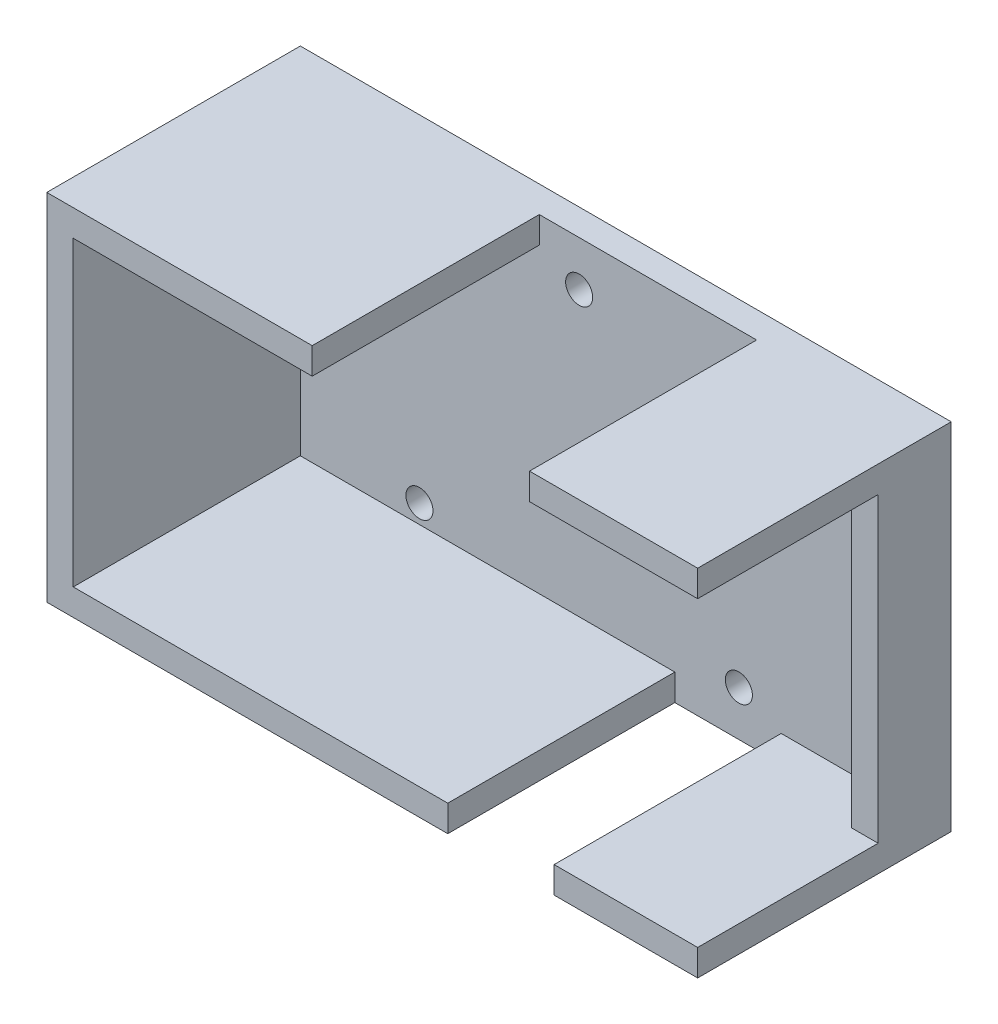
ISO-10303-21;
HEADER;
FILE_DESCRIPTION(('STEP AP214'),'2;1');
FILE_NAME('part.step','',(''),(''),'','','');
FILE_SCHEMA(('AUTOMOTIVE_DESIGN { 1 0 10303 214 1 1 1 1 }'));
ENDSEC;
DATA;
#1=APPLICATION_CONTEXT('core data for automotive mechanical design processes');
#2=APPLICATION_PROTOCOL_DEFINITION('international standard','automotive_design',2000,#1);
#3=PRODUCT_CONTEXT('',#1,'mechanical');
#4=PRODUCT('Part','Part','',(#3));
#5=PRODUCT_RELATED_PRODUCT_CATEGORY('part','',(#4));
#6=PRODUCT_DEFINITION_FORMATION('','',#4);
#7=PRODUCT_DEFINITION_CONTEXT('part definition',#1,'design');
#8=PRODUCT_DEFINITION('design','',#6,#7);
#9=PRODUCT_DEFINITION_SHAPE('','',#8);
#10=(LENGTH_UNIT() NAMED_UNIT(*) SI_UNIT(.MILLI.,.METRE.));
#11=(NAMED_UNIT(*) PLANE_ANGLE_UNIT() SI_UNIT($,.RADIAN.));
#12=(NAMED_UNIT(*) SI_UNIT($,.STERADIAN.) SOLID_ANGLE_UNIT());
#13=UNCERTAINTY_MEASURE_WITH_UNIT(LENGTH_MEASURE(1.E-05),#10,'distance_accuracy_value','');
#14=(GEOMETRIC_REPRESENTATION_CONTEXT(3) GLOBAL_UNCERTAINTY_ASSIGNED_CONTEXT((#13)) GLOBAL_UNIT_ASSIGNED_CONTEXT((#10,
#11,#12)) REPRESENTATION_CONTEXT('',''));
#15=CARTESIAN_POINT('',(0.,0.,0.));
#16=DIRECTION('',(0.,0.,1.));
#17=DIRECTION('',(1.,0.,0.));
#18=AXIS2_PLACEMENT_3D('',#15,#16,#17);
#19=CARTESIAN_POINT('',(-27.4828,-14.986,21.4122));
#20=DIRECTION('',(1.,0.,0.));
#21=DIRECTION('',(0.,0.,-1.));
#22=AXIS2_PLACEMENT_3D('',#19,#20,#21);
#23=PLANE('',#22);
#24=DIRECTION('',(0.,0.,1.));
#25=VECTOR('',#24,1.);
#26=CARTESIAN_POINT('',(-27.4828,-7.2136,0.));
#27=LINE('',#26,#25);
#28=CARTESIAN_POINT('',(-27.4828,-7.2136,0.));
#29=VERTEX_POINT('',#28);
#30=CARTESIAN_POINT('',(-27.4828,-7.2136,0.634999999999999));
#31=VERTEX_POINT('',#30);
#32=EDGE_CURVE('E584',#29,#31,#27,.T.);
#33=ORIENTED_EDGE('',*,*,#32,.F.);
#34=DIRECTION('',(0.,-1.,0.));
#35=VECTOR('',#34,1.);
#36=CARTESIAN_POINT('',(-27.4828,-14.986,0.));
#37=LINE('',#36,#35);
#38=CARTESIAN_POINT('',(-27.4828,-14.986,0.));
#39=VERTEX_POINT('',#38);
#40=EDGE_CURVE('E48',#29,#39,#37,.T.);
#41=ORIENTED_EDGE('',*,*,#40,.T.);
#42=DIRECTION('',(0.,0.,-1.));
#43=VECTOR('',#42,1.);
#44=CARTESIAN_POINT('',(-27.4828,-14.986,21.4122));
#45=LINE('',#44,#43);
#46=CARTESIAN_POINT('',(-27.4828,-14.986,21.4122));
#47=VERTEX_POINT('',#46);
#48=EDGE_CURVE('E556',#47,#39,#45,.T.);
#49=ORIENTED_EDGE('',*,*,#48,.F.);
#50=DIRECTION('',(0.,-1.,0.));
#51=VECTOR('',#50,1.);
#52=CARTESIAN_POINT('',(-27.4828,-14.986,21.4122));
#53=LINE('',#52,#51);
#54=CARTESIAN_POINT('',(-27.4828,14.986,21.4122));
#55=VERTEX_POINT('',#54);
#56=EDGE_CURVE('E518',#55,#47,#53,.T.);
#57=ORIENTED_EDGE('',*,*,#56,.F.);
#58=DIRECTION('',(0.,0.,-1.));
#59=VECTOR('',#58,1.);
#60=CARTESIAN_POINT('',(-27.4828,14.986,21.4122));
#61=LINE('',#60,#59);
#62=CARTESIAN_POINT('',(-27.4828,14.986,0.));
#63=VERTEX_POINT('',#62);
#64=EDGE_CURVE('E55',#55,#63,#61,.T.);
#65=ORIENTED_EDGE('',*,*,#64,.T.);
#66=CARTESIAN_POINT('',(-27.4828,7.366,0.));
#67=VERTEX_POINT('',#66);
#68=EDGE_CURVE('E541',#63,#67,#37,.T.);
#69=ORIENTED_EDGE('',*,*,#68,.T.);
#70=DIRECTION('',(0.,0.,-1.));
#71=VECTOR('',#70,1.);
#72=CARTESIAN_POINT('',(-27.4828,7.366,0.));
#73=LINE('',#72,#71);
#74=CARTESIAN_POINT('',(-27.4828,7.366,0.634999999999998));
#75=VERTEX_POINT('',#74);
#76=EDGE_CURVE('E315',#75,#67,#73,.T.);
#77=ORIENTED_EDGE('',*,*,#76,.F.);
#78=DIRECTION('',(0.,1.,0.));
#79=VECTOR('',#78,1.);
#80=CARTESIAN_POINT('',(-27.4828,7.366,0.634999999999998));
#81=LINE('',#80,#79);
#82=CARTESIAN_POINT('',(-27.4828,5.5372,0.634999999999999));
#83=VERTEX_POINT('',#82);
#84=EDGE_CURVE('E303',#83,#75,#81,.T.);
#85=ORIENTED_EDGE('',*,*,#84,.F.);
#86=DIRECTION('',(0.,0.,1.));
#87=VECTOR('',#86,1.);
#88=CARTESIAN_POINT('',(-27.4828,5.5372,0.));
#89=LINE('',#88,#87);
#90=CARTESIAN_POINT('',(-27.4828,5.5372,0.));
#91=VERTEX_POINT('',#90);
#92=EDGE_CURVE('E298',#91,#83,#89,.T.);
#93=ORIENTED_EDGE('',*,*,#92,.F.);
#94=CARTESIAN_POINT('',(-27.4828,-5.3848,0.));
#95=VERTEX_POINT('',#94);
#96=EDGE_CURVE('E539',#91,#95,#37,.T.);
#97=ORIENTED_EDGE('',*,*,#96,.T.);
#98=DIRECTION('',(0.,0.,-1.));
#99=VECTOR('',#98,1.);
#100=CARTESIAN_POINT('',(-27.4828,-5.3848,0.));
#101=LINE('',#100,#99);
#102=CARTESIAN_POINT('',(-27.4828,-5.3848,0.635));
#103=VERTEX_POINT('',#102);
#104=EDGE_CURVE('E73',#103,#95,#101,.T.);
#105=ORIENTED_EDGE('',*,*,#104,.F.);
#106=DIRECTION('',(0.,1.,0.));
#107=VECTOR('',#106,1.);
#108=CARTESIAN_POINT('',(-27.4828,-5.3848,0.635));
#109=LINE('',#108,#107);
#110=EDGE_CURVE('E66',#31,#103,#109,.T.);
#111=ORIENTED_EDGE('',*,*,#110,.F.);
#112=EDGE_LOOP('',(#33,#41,#49,#57,#65,#69,#77,#85,#93,#97,#105,#111));
#113=FACE_BOUND('',#112,.T.);
#114=ADVANCED_FACE('F44',(#113),#23,.F.);
#115=CARTESIAN_POINT('',(0.,0.,21.4122));
#116=DIRECTION('',(0.,0.,-1.));
#117=DIRECTION('',(-1.,0.,0.));
#118=AXIS2_PLACEMENT_3D('',#115,#116,#117);
#119=PLANE('',#118);
#120=DIRECTION('',(-1.,0.,0.));
#121=VECTOR('',#120,1.);
#122=CARTESIAN_POINT('',(-27.4828,14.986,21.4122));
#123=LINE('',#122,#121);
#124=CARTESIAN_POINT('',(27.4828,14.986,21.4122));
#125=VERTEX_POINT('',#124);
#126=CARTESIAN_POINT('',(13.2840158304135,14.986,21.4122));
#127=VERTEX_POINT('',#126);
#128=EDGE_CURVE('E514',#125,#127,#123,.T.);
#129=ORIENTED_EDGE('',*,*,#128,.T.);
#130=DIRECTION('',(0.,1.,0.));
#131=VECTOR('',#130,1.);
#132=CARTESIAN_POINT('',(13.2840158304135,14.986,21.4122));
#133=LINE('',#132,#131);
#134=CARTESIAN_POINT('',(13.2840158304135,12.7508,21.4122));
#135=VERTEX_POINT('',#134);
#136=EDGE_CURVE('E362',#135,#127,#133,.T.);
#137=ORIENTED_EDGE('',*,*,#136,.F.);
#138=DIRECTION('',(-1.,0.,0.));
#139=VECTOR('',#138,1.);
#140=CARTESIAN_POINT('',(0.,12.7508,21.4122));
#141=LINE('',#140,#139);
#142=CARTESIAN_POINT('',(27.4828,12.7508,21.4122));
#143=VERTEX_POINT('',#142);
#144=EDGE_CURVE('E496',#143,#135,#141,.T.);
#145=ORIENTED_EDGE('',*,*,#144,.F.);
#146=DIRECTION('',(0.,1.,0.));
#147=VECTOR('',#146,1.);
#148=CARTESIAN_POINT('',(27.4828,-14.986,21.4122));
#149=LINE('',#148,#147);
#150=EDGE_CURVE('E513',#143,#125,#149,.T.);
#151=ORIENTED_EDGE('',*,*,#150,.T.);
#152=EDGE_LOOP('',(#129,#137,#145,#151));
#153=FACE_BOUND('',#152,.T.);
#154=ADVANCED_FACE('F616',(#153),#119,.F.);
#155=CARTESIAN_POINT('',(-27.4828,12.7508,21.4122));
#156=DIRECTION('',(0.,-1.,0.));
#157=DIRECTION('',(0.,0.,-1.));
#158=AXIS2_PLACEMENT_3D('',#155,#156,#157);
#159=PLANE('',#158);
#160=DIRECTION('',(0.,0.,1.));
#161=VECTOR('',#160,1.);
#162=CARTESIAN_POINT('',(13.2840158304135,12.7508,-16.2527545378796));
#163=LINE('',#162,#161);
#164=CARTESIAN_POINT('',(13.2840158304135,12.7508,2.2352));
#165=VERTEX_POINT('',#164);
#166=EDGE_CURVE('E365',#165,#135,#163,.T.);
#167=ORIENTED_EDGE('',*,*,#166,.F.);
#168=DIRECTION('',(-1.,0.,0.));
#169=VECTOR('',#168,1.);
#170=CARTESIAN_POINT('',(0.,12.7508,2.2352));
#171=LINE('',#170,#169);
#172=CARTESIAN_POINT('',(25.2476,12.7508,2.2352));
#173=VERTEX_POINT('',#172);
#174=EDGE_CURVE('E477',#173,#165,#171,.T.);
#175=ORIENTED_EDGE('',*,*,#174,.F.);
#176=DIRECTION('',(0.,0.,-1.));
#177=VECTOR('',#176,1.);
#178=CARTESIAN_POINT('',(25.2476,12.7508,21.4122));
#179=LINE('',#178,#177);
#180=CARTESIAN_POINT('',(25.2476,12.7508,6.1722));
#181=VERTEX_POINT('',#180);
#182=EDGE_CURVE('E466',#181,#173,#179,.T.);
#183=ORIENTED_EDGE('',*,*,#182,.F.);
#184=DIRECTION('',(-1.,0.,0.));
#185=VECTOR('',#184,1.);
#186=CARTESIAN_POINT('',(25.2476,12.7508,6.1722));
#187=LINE('',#186,#185);
#188=CARTESIAN_POINT('',(27.4828,12.7508,6.1722));
#189=VERTEX_POINT('',#188);
#190=EDGE_CURVE('E435',#189,#181,#187,.T.);
#191=ORIENTED_EDGE('',*,*,#190,.F.);
#192=DIRECTION('',(0.,0.,1.));
#193=VECTOR('',#192,1.);
#194=CARTESIAN_POINT('',(27.4828,12.7508,6.1722));
#195=LINE('',#194,#193);
#196=EDGE_CURVE('E439',#189,#143,#195,.T.);
#197=ORIENTED_EDGE('',*,*,#196,.T.);
#198=ORIENTED_EDGE('',*,*,#144,.T.);
#199=EDGE_LOOP('',(#167,#175,#183,#191,#197,#198));
#200=FACE_BOUND('',#199,.T.);
#201=ADVANCED_FACE('F621',(#200),#159,.T.);
#202=CARTESIAN_POINT('',(-5.06832309286009,12.7508,21.4122));
#203=VERTEX_POINT('',#202);
#204=CARTESIAN_POINT('',(-25.2476,12.7508,21.4122));
#205=VERTEX_POINT('',#204);
#206=EDGE_CURVE('E495',#203,#205,#141,.T.);
#207=ORIENTED_EDGE('',*,*,#206,.F.);
#208=DIRECTION('',(0.,-1.,0.));
#209=VECTOR('',#208,1.);
#210=CARTESIAN_POINT('',(-5.06832309286009,14.986,21.4122));
#211=LINE('',#210,#209);
#212=CARTESIAN_POINT('',(-5.06832309286009,14.986,21.4122));
#213=VERTEX_POINT('',#212);
#214=EDGE_CURVE('E360',#213,#203,#211,.T.);
#215=ORIENTED_EDGE('',*,*,#214,.F.);
#216=EDGE_CURVE('E512',#213,#55,#123,.T.);
#217=ORIENTED_EDGE('',*,*,#216,.T.);
#218=ORIENTED_EDGE('',*,*,#56,.T.);
#219=DIRECTION('',(1.,0.,0.));
#220=VECTOR('',#219,1.);
#221=CARTESIAN_POINT('',(-27.4828,-14.986,21.4122));
#222=LINE('',#221,#220);
#223=CARTESIAN_POINT('',(6.37948859144543,-14.986,21.4122));
#224=VERTEX_POINT('',#223);
#225=EDGE_CURVE('E522',#47,#224,#222,.T.);
#226=ORIENTED_EDGE('',*,*,#225,.T.);
#227=DIRECTION('',(0.,-1.,0.));
#228=VECTOR('',#227,1.);
#229=CARTESIAN_POINT('',(6.37948859144543,-14.986,21.4122));
#230=LINE('',#229,#228);
#231=CARTESIAN_POINT('',(6.37948859144543,-12.7508,21.4122));
#232=VERTEX_POINT('',#231);
#233=EDGE_CURVE('E394',#232,#224,#230,.T.);
#234=ORIENTED_EDGE('',*,*,#233,.F.);
#235=DIRECTION('',(1.,0.,0.));
#236=VECTOR('',#235,1.);
#237=CARTESIAN_POINT('',(0.,-12.7508,21.4122));
#238=LINE('',#237,#236);
#239=CARTESIAN_POINT('',(-25.2476,-12.7508,21.4122));
#240=VERTEX_POINT('',#239);
#241=EDGE_CURVE('E476',#240,#232,#238,.T.);
#242=ORIENTED_EDGE('',*,*,#241,.F.);
#243=DIRECTION('',(0.,-1.,0.));
#244=VECTOR('',#243,1.);
#245=CARTESIAN_POINT('',(-25.2476,0.,21.4122));
#246=LINE('',#245,#244);
#247=EDGE_CURVE('E500',#205,#240,#246,.T.);
#248=ORIENTED_EDGE('',*,*,#247,.F.);
#249=EDGE_LOOP('',(#207,#215,#217,#218,#226,#234,#242,#248));
#250=FACE_BOUND('',#249,.T.);
#251=ADVANCED_FACE('F623',(#250),#119,.F.);
#252=CARTESIAN_POINT('',(-27.4828,-12.7508,21.4122));
#253=DIRECTION('',(0.,1.,0.));
#254=DIRECTION('',(0.,0.,1.));
#255=AXIS2_PLACEMENT_3D('',#252,#253,#254);
#256=PLANE('',#255);
#257=DIRECTION('',(0.,0.,1.));
#258=VECTOR('',#257,1.);
#259=CARTESIAN_POINT('',(6.37948859144543,-12.7508,-16.2527545378796));
#260=LINE('',#259,#258);
#261=CARTESIAN_POINT('',(6.37948859144543,-12.7508,2.2352));
#262=VERTEX_POINT('',#261);
#263=EDGE_CURVE('E397',#262,#232,#260,.T.);
#264=ORIENTED_EDGE('',*,*,#263,.F.);
#265=DIRECTION('',(1.,0.,0.));
#266=VECTOR('',#265,1.);
#267=CARTESIAN_POINT('',(0.,-12.7508,2.2352));
#268=LINE('',#267,#266);
#269=CARTESIAN_POINT('',(-25.2476,-12.7508,2.2352));
#270=VERTEX_POINT('',#269);
#271=EDGE_CURVE('E491',#270,#262,#268,.T.);
#272=ORIENTED_EDGE('',*,*,#271,.F.);
#273=DIRECTION('',(0.,0.,-1.));
#274=VECTOR('',#273,1.);
#275=CARTESIAN_POINT('',(-25.2476,-12.7508,21.4122));
#276=LINE('',#275,#274);
#277=EDGE_CURVE('E475',#240,#270,#276,.T.);
#278=ORIENTED_EDGE('',*,*,#277,.F.);
#279=ORIENTED_EDGE('',*,*,#241,.T.);
#280=EDGE_LOOP('',(#264,#272,#278,#279));
#281=FACE_BOUND('',#280,.T.);
#282=ADVANCED_FACE('F635',(#281),#256,.T.);
#283=CARTESIAN_POINT('',(15.3610224191685,-12.7508,21.4122));
#284=VERTEX_POINT('',#283);
#285=CARTESIAN_POINT('',(27.4828,-12.7508,21.4122));
#286=VERTEX_POINT('',#285);
#287=EDGE_CURVE('E504',#284,#286,#238,.T.);
#288=ORIENTED_EDGE('',*,*,#287,.F.);
#289=DIRECTION('',(0.,1.,0.));
#290=VECTOR('',#289,1.);
#291=CARTESIAN_POINT('',(15.3610224191685,-14.986,21.4122));
#292=LINE('',#291,#290);
#293=CARTESIAN_POINT('',(15.3610224191685,-14.986,21.4122));
#294=VERTEX_POINT('',#293);
#295=EDGE_CURVE('E393',#294,#284,#292,.T.);
#296=ORIENTED_EDGE('',*,*,#295,.F.);
#297=CARTESIAN_POINT('',(27.4828,-14.986,21.4122));
#298=VERTEX_POINT('',#297);
#299=EDGE_CURVE('E521',#294,#298,#222,.T.);
#300=ORIENTED_EDGE('',*,*,#299,.T.);
#301=EDGE_CURVE('E508',#298,#286,#149,.T.);
#302=ORIENTED_EDGE('',*,*,#301,.T.);
#303=EDGE_LOOP('',(#288,#296,#300,#302));
#304=FACE_BOUND('',#303,.T.);
#305=ADVANCED_FACE('F624',(#304),#119,.F.);
#306=CARTESIAN_POINT('',(27.4828,-14.986,21.4122));
#307=DIRECTION('',(-1.,0.,0.));
#308=DIRECTION('',(0.,0.,1.));
#309=AXIS2_PLACEMENT_3D('',#306,#307,#308);
#310=PLANE('',#309);
#311=ORIENTED_EDGE('',*,*,#150,.F.);
#312=ORIENTED_EDGE('',*,*,#196,.F.);
#313=DIRECTION('',(0.,1.,0.));
#314=VECTOR('',#313,1.);
#315=CARTESIAN_POINT('',(27.4828,-12.7508,6.1722));
#316=LINE('',#315,#314);
#317=CARTESIAN_POINT('',(27.4828,-12.7508,6.1722));
#318=VERTEX_POINT('',#317);
#319=EDGE_CURVE('E432',#318,#189,#316,.T.);
#320=ORIENTED_EDGE('',*,*,#319,.F.);
#321=DIRECTION('',(0.,0.,1.));
#322=VECTOR('',#321,1.);
#323=CARTESIAN_POINT('',(27.4828,-12.7508,6.1722));
#324=LINE('',#323,#322);
#325=EDGE_CURVE('E438',#318,#286,#324,.T.);
#326=ORIENTED_EDGE('',*,*,#325,.T.);
#327=ORIENTED_EDGE('',*,*,#301,.F.);
#328=DIRECTION('',(0.,0.,-1.));
#329=VECTOR('',#328,1.);
#330=CARTESIAN_POINT('',(27.4828,-14.986,21.4122));
#331=LINE('',#330,#329);
#332=CARTESIAN_POINT('',(27.4828,-14.986,0.));
#333=VERTEX_POINT('',#332);
#334=EDGE_CURVE('E526',#298,#333,#331,.T.);
#335=ORIENTED_EDGE('',*,*,#334,.T.);
#336=DIRECTION('',(0.,1.,0.));
#337=VECTOR('',#336,1.);
#338=CARTESIAN_POINT('',(27.4828,-14.986,0.));
#339=LINE('',#338,#337);
#340=CARTESIAN_POINT('',(27.4828,14.986,0.));
#341=VERTEX_POINT('',#340);
#342=EDGE_CURVE('E469',#333,#341,#339,.T.);
#343=ORIENTED_EDGE('',*,*,#342,.T.);
#344=DIRECTION('',(0.,0.,-1.));
#345=VECTOR('',#344,1.);
#346=CARTESIAN_POINT('',(27.4828,14.986,21.4122));
#347=LINE('',#346,#345);
#348=EDGE_CURVE('E11',#125,#341,#347,.T.);
#349=ORIENTED_EDGE('',*,*,#348,.F.);
#350=EDGE_LOOP('',(#311,#312,#320,#326,#327,#335,#343,#349));
#351=FACE_BOUND('',#350,.T.);
#352=ADVANCED_FACE('F46',(#351),#310,.F.);
#353=CARTESIAN_POINT('',(-27.4828,14.986,21.4122));
#354=DIRECTION('',(0.,-1.,0.));
#355=DIRECTION('',(0.,0.,-1.));
#356=AXIS2_PLACEMENT_3D('',#353,#354,#355);
#357=PLANE('',#356);
#358=DIRECTION('',(-1.,0.,0.));
#359=VECTOR('',#358,1.);
#360=CARTESIAN_POINT('',(-5.06832309286009,14.986,2.2352));
#361=LINE('',#360,#359);
#362=CARTESIAN_POINT('',(13.2840158304135,14.986,2.2352));
#363=VERTEX_POINT('',#362);
#364=CARTESIAN_POINT('',(-5.06832309286009,14.986,2.2352));
#365=VERTEX_POINT('',#364);
#366=EDGE_CURVE('E374',#363,#365,#361,.T.);
#367=ORIENTED_EDGE('',*,*,#366,.F.);
#368=DIRECTION('',(0.,0.,1.));
#369=VECTOR('',#368,1.);
#370=CARTESIAN_POINT('',(13.2840158304135,14.986,-16.2527545378796));
#371=LINE('',#370,#369);
#372=EDGE_CURVE('E378',#363,#127,#371,.T.);
#373=ORIENTED_EDGE('',*,*,#372,.T.);
#374=ORIENTED_EDGE('',*,*,#128,.F.);
#375=ORIENTED_EDGE('',*,*,#348,.T.);
#376=DIRECTION('',(-1.,0.,0.));
#377=VECTOR('',#376,1.);
#378=CARTESIAN_POINT('',(-27.4828,14.986,0.));
#379=LINE('',#378,#377);
#380=EDGE_CURVE('E530',#341,#63,#379,.T.);
#381=ORIENTED_EDGE('',*,*,#380,.T.);
#382=ORIENTED_EDGE('',*,*,#64,.F.);
#383=ORIENTED_EDGE('',*,*,#216,.F.);
#384=DIRECTION('',(0.,0.,1.));
#385=VECTOR('',#384,1.);
#386=CARTESIAN_POINT('',(-5.06832309286009,14.986,-16.2527545378796));
#387=LINE('',#386,#385);
#388=EDGE_CURVE('E373',#365,#213,#387,.T.);
#389=ORIENTED_EDGE('',*,*,#388,.F.);
#390=EDGE_LOOP('',(#367,#373,#374,#375,#381,#382,#383,#389));
#391=FACE_BOUND('',#390,.T.);
#392=ADVANCED_FACE('F572',(#391),#357,.F.);
#393=CARTESIAN_POINT('',(-27.4828,-14.986,21.4122));
#394=DIRECTION('',(0.,1.,0.));
#395=DIRECTION('',(0.,0.,1.));
#396=AXIS2_PLACEMENT_3D('',#393,#394,#395);
#397=PLANE('',#396);
#398=DIRECTION('',(1.,0.,0.));
#399=VECTOR('',#398,1.);
#400=CARTESIAN_POINT('',(15.3610224191685,-14.986,2.2352));
#401=LINE('',#400,#399);
#402=CARTESIAN_POINT('',(6.37948859144543,-14.986,2.2352));
#403=VERTEX_POINT('',#402);
#404=CARTESIAN_POINT('',(15.3610224191685,-14.986,2.2352));
#405=VERTEX_POINT('',#404);
#406=EDGE_CURVE('E406',#403,#405,#401,.T.);
#407=ORIENTED_EDGE('',*,*,#406,.F.);
#408=DIRECTION('',(0.,0.,1.));
#409=VECTOR('',#408,1.);
#410=CARTESIAN_POINT('',(6.37948859144543,-14.986,-16.2527545378796));
#411=LINE('',#410,#409);
#412=EDGE_CURVE('E410',#403,#224,#411,.T.);
#413=ORIENTED_EDGE('',*,*,#412,.T.);
#414=ORIENTED_EDGE('',*,*,#225,.F.);
#415=ORIENTED_EDGE('',*,*,#48,.T.);
#416=DIRECTION('',(1.,0.,0.));
#417=VECTOR('',#416,1.);
#418=CARTESIAN_POINT('',(-27.4828,-14.986,0.));
#419=LINE('',#418,#417);
#420=EDGE_CURVE('E534',#39,#333,#419,.T.);
#421=ORIENTED_EDGE('',*,*,#420,.T.);
#422=ORIENTED_EDGE('',*,*,#334,.F.);
#423=ORIENTED_EDGE('',*,*,#299,.F.);
#424=DIRECTION('',(0.,0.,1.));
#425=VECTOR('',#424,1.);
#426=CARTESIAN_POINT('',(15.3610224191685,-14.986,-16.2527545378796));
#427=LINE('',#426,#425);
#428=EDGE_CURVE('E405',#405,#294,#427,.T.);
#429=ORIENTED_EDGE('',*,*,#428,.F.);
#430=EDGE_LOOP('',(#407,#413,#414,#415,#421,#422,#423,#429));
#431=FACE_BOUND('',#430,.T.);
#432=ADVANCED_FACE('F580',(#431),#397,.F.);
#433=CARTESIAN_POINT('',(0.,0.,0.));
#434=DIRECTION('',(0.,0.,-1.));
#435=DIRECTION('',(-1.,0.,0.));
#436=AXIS2_PLACEMENT_3D('',#433,#434,#435);
#437=PLANE('',#436);
#438=CARTESIAN_POINT('',(-15.1892,-11.176,0.));
#439=DIRECTION('',(0.,0.,-1.));
#440=DIRECTION('',(-1.,0.,0.));
#441=AXIS2_PLACEMENT_3D('',#438,#439,#440);
#442=CIRCLE('',#441,1.143);
#443=CARTESIAN_POINT('',(-16.3322,-11.176,0.));
#444=VERTEX_POINT('',#443);
#445=EDGE_CURVE('E443',#444,#444,#442,.T.);
#446=ORIENTED_EDGE('',*,*,#445,.F.);
#447=EDGE_LOOP('',(#446));
#448=FACE_BOUND('',#447,.T.);
#449=CARTESIAN_POINT('',(11.7856,-11.176,0.));
#450=DIRECTION('',(0.,0.,-1.));
#451=DIRECTION('',(-1.,0.,0.));
#452=AXIS2_PLACEMENT_3D('',#449,#450,#451);
#453=CIRCLE('',#452,1.143);
#454=CARTESIAN_POINT('',(10.6426,-11.176,0.));
#455=VERTEX_POINT('',#454);
#456=EDGE_CURVE('E451',#455,#455,#453,.T.);
#457=ORIENTED_EDGE('',*,*,#456,.F.);
#458=EDGE_LOOP('',(#457));
#459=FACE_BOUND('',#458,.T.);
#460=CARTESIAN_POINT('',(-1.70180000000001,11.176,0.));
#461=DIRECTION('',(0.,0.,-1.));
#462=DIRECTION('',(-1.,0.,0.));
#463=AXIS2_PLACEMENT_3D('',#460,#461,#462);
#464=CIRCLE('',#463,1.143);
#465=CARTESIAN_POINT('',(-2.84480000000001,11.176,0.));
#466=VERTEX_POINT('',#465);
#467=EDGE_CURVE('E456',#466,#466,#464,.T.);
#468=ORIENTED_EDGE('',*,*,#467,.F.);
#469=EDGE_LOOP('',(#468));
#470=FACE_BOUND('',#469,.T.);
#471=ORIENTED_EDGE('',*,*,#342,.F.);
#472=ORIENTED_EDGE('',*,*,#420,.F.);
#473=ORIENTED_EDGE('',*,*,#40,.F.);
#474=DIRECTION('',(1.,0.,0.));
#475=VECTOR('',#474,1.);
#476=CARTESIAN_POINT('',(-32.5628,-7.2136,0.));
#477=LINE('',#476,#475);
#478=CARTESIAN_POINT('',(-32.5628,-7.2136,0.));
#479=VERTEX_POINT('',#478);
#480=EDGE_CURVE('E276',#479,#29,#477,.T.);
#481=ORIENTED_EDGE('',*,*,#480,.F.);
#482=DIRECTION('',(0.,-1.,0.));
#483=VECTOR('',#482,1.);
#484=CARTESIAN_POINT('',(-32.5628,-5.3848,0.));
#485=LINE('',#484,#483);
#486=CARTESIAN_POINT('',(-32.5628,-5.3848,0.));
#487=VERTEX_POINT('',#486);
#488=EDGE_CURVE('E283',#487,#479,#485,.T.);
#489=ORIENTED_EDGE('',*,*,#488,.F.);
#490=DIRECTION('',(1.,0.,0.));
#491=VECTOR('',#490,1.);
#492=CARTESIAN_POINT('',(-32.5628,-5.3848,0.));
#493=LINE('',#492,#491);
#494=EDGE_CURVE('E590',#487,#95,#493,.T.);
#495=ORIENTED_EDGE('',*,*,#494,.T.);
#496=ORIENTED_EDGE('',*,*,#96,.F.);
#497=DIRECTION('',(1.,0.,0.));
#498=VECTOR('',#497,1.);
#499=CARTESIAN_POINT('',(-32.5628,5.5372,0.));
#500=LINE('',#499,#498);
#501=CARTESIAN_POINT('',(-32.5628,5.5372,0.));
#502=VERTEX_POINT('',#501);
#503=EDGE_CURVE('E355',#502,#91,#500,.T.);
#504=ORIENTED_EDGE('',*,*,#503,.F.);
#505=DIRECTION('',(0.,-1.,0.));
#506=VECTOR('',#505,1.);
#507=CARTESIAN_POINT('',(-32.5628,7.366,0.));
#508=LINE('',#507,#506);
#509=CARTESIAN_POINT('',(-32.5628,7.366,0.));
#510=VERTEX_POINT('',#509);
#511=EDGE_CURVE('E310',#510,#502,#508,.T.);
#512=ORIENTED_EDGE('',*,*,#511,.F.);
#513=DIRECTION('',(1.,0.,0.));
#514=VECTOR('',#513,1.);
#515=CARTESIAN_POINT('',(-32.5628,7.366,0.));
#516=LINE('',#515,#514);
#517=EDGE_CURVE('E324',#510,#67,#516,.T.);
#518=ORIENTED_EDGE('',*,*,#517,.T.);
#519=ORIENTED_EDGE('',*,*,#68,.F.);
#520=ORIENTED_EDGE('',*,*,#380,.F.);
#521=EDGE_LOOP('',(#471,#472,#473,#481,#489,#495,#496,#504,#512,#518,#519,#520));
#522=FACE_BOUND('',#521,.T.);
#523=ADVANCED_FACE('F295',(#448,#459,#470,#522),#437,.T.);
#524=CARTESIAN_POINT('',(25.2476,-14.986,21.4122));
#525=DIRECTION('',(-1.,0.,0.));
#526=DIRECTION('',(0.,0.,1.));
#527=AXIS2_PLACEMENT_3D('',#524,#525,#526);
#528=PLANE('',#527);
#529=DIRECTION('',(0.,-1.,0.));
#530=VECTOR('',#529,1.);
#531=CARTESIAN_POINT('',(25.2476,-12.7508,6.1722));
#532=LINE('',#531,#530);
#533=CARTESIAN_POINT('',(25.2476,-12.7508,6.1722));
#534=VERTEX_POINT('',#533);
#535=EDGE_CURVE('E425',#181,#534,#532,.T.);
#536=ORIENTED_EDGE('',*,*,#535,.F.);
#537=ORIENTED_EDGE('',*,*,#182,.T.);
#538=DIRECTION('',(0.,1.,0.));
#539=VECTOR('',#538,1.);
#540=CARTESIAN_POINT('',(25.2476,0.,2.2352));
#541=LINE('',#540,#539);
#542=CARTESIAN_POINT('',(25.2476,-12.7508,2.2352));
#543=VERTEX_POINT('',#542);
#544=EDGE_CURVE('E461',#543,#173,#541,.T.);
#545=ORIENTED_EDGE('',*,*,#544,.F.);
#546=DIRECTION('',(0.,0.,-1.));
#547=VECTOR('',#546,1.);
#548=CARTESIAN_POINT('',(25.2476,-12.7508,21.4122));
#549=LINE('',#548,#547);
#550=EDGE_CURVE('E471',#534,#543,#549,.T.);
#551=ORIENTED_EDGE('',*,*,#550,.F.);
#552=EDGE_LOOP('',(#536,#537,#545,#551));
#553=FACE_BOUND('',#552,.T.);
#554=ADVANCED_FACE('F690',(#553),#528,.T.);
#555=DIRECTION('',(0.,0.,1.));
#556=VECTOR('',#555,1.);
#557=CARTESIAN_POINT('',(-5.06832309286009,12.7508,-16.2527545378796));
#558=LINE('',#557,#556);
#559=CARTESIAN_POINT('',(-5.06832309286009,12.7508,2.2352));
#560=VERTEX_POINT('',#559);
#561=EDGE_CURVE('E372',#560,#203,#558,.T.);
#562=ORIENTED_EDGE('',*,*,#561,.T.);
#563=ORIENTED_EDGE('',*,*,#206,.T.);
#564=DIRECTION('',(0.,0.,-1.));
#565=VECTOR('',#564,1.);
#566=CARTESIAN_POINT('',(-25.2476,12.7508,21.4122));
#567=LINE('',#566,#565);
#568=CARTESIAN_POINT('',(-25.2476,12.7508,2.2352));
#569=VERTEX_POINT('',#568);
#570=EDGE_CURVE('E470',#205,#569,#567,.T.);
#571=ORIENTED_EDGE('',*,*,#570,.T.);
#572=EDGE_CURVE('E465',#560,#569,#171,.T.);
#573=ORIENTED_EDGE('',*,*,#572,.F.);
#574=EDGE_LOOP('',(#562,#563,#571,#573));
#575=FACE_BOUND('',#574,.T.);
#576=ADVANCED_FACE('F652',(#575),#159,.T.);
#577=CARTESIAN_POINT('',(-25.2476,-14.986,21.4122));
#578=DIRECTION('',(1.,0.,0.));
#579=DIRECTION('',(0.,0.,-1.));
#580=AXIS2_PLACEMENT_3D('',#577,#578,#579);
#581=PLANE('',#580);
#582=DIRECTION('',(0.,-1.,0.));
#583=VECTOR('',#582,1.);
#584=CARTESIAN_POINT('',(-25.2476,0.,2.2352));
#585=LINE('',#584,#583);
#586=EDGE_CURVE('E481',#569,#270,#585,.T.);
#587=ORIENTED_EDGE('',*,*,#586,.F.);
#588=ORIENTED_EDGE('',*,*,#570,.F.);
#589=ORIENTED_EDGE('',*,*,#247,.T.);
#590=ORIENTED_EDGE('',*,*,#277,.T.);
#591=EDGE_LOOP('',(#587,#588,#589,#590));
#592=FACE_BOUND('',#591,.T.);
#593=ADVANCED_FACE('F668',(#592),#581,.T.);
#594=DIRECTION('',(0.,0.,1.));
#595=VECTOR('',#594,1.);
#596=CARTESIAN_POINT('',(15.3610224191685,-12.7508,-16.2527545378796));
#597=LINE('',#596,#595);
#598=CARTESIAN_POINT('',(15.3610224191685,-12.7508,2.2352));
#599=VERTEX_POINT('',#598);
#600=EDGE_CURVE('E404',#599,#284,#597,.T.);
#601=ORIENTED_EDGE('',*,*,#600,.T.);
#602=ORIENTED_EDGE('',*,*,#287,.T.);
#603=ORIENTED_EDGE('',*,*,#325,.F.);
#604=DIRECTION('',(1.,0.,0.));
#605=VECTOR('',#604,1.);
#606=CARTESIAN_POINT('',(25.2476,-12.7508,6.1722));
#607=LINE('',#606,#605);
#608=EDGE_CURVE('E428',#534,#318,#607,.T.);
#609=ORIENTED_EDGE('',*,*,#608,.F.);
#610=ORIENTED_EDGE('',*,*,#550,.T.);
#611=EDGE_CURVE('E487',#599,#543,#268,.T.);
#612=ORIENTED_EDGE('',*,*,#611,.F.);
#613=EDGE_LOOP('',(#601,#602,#603,#609,#610,#612));
#614=FACE_BOUND('',#613,.T.);
#615=ADVANCED_FACE('F642',(#614),#256,.T.);
#616=CARTESIAN_POINT('',(0.,0.,2.2352));
#617=DIRECTION('',(0.,0.,-1.));
#618=DIRECTION('',(-1.,0.,0.));
#619=AXIS2_PLACEMENT_3D('',#616,#617,#618);
#620=PLANE('',#619);
#621=CARTESIAN_POINT('',(-15.1892,-11.176,2.2352));
#622=DIRECTION('',(0.,0.,-1.));
#623=DIRECTION('',(-1.,0.,0.));
#624=AXIS2_PLACEMENT_3D('',#621,#622,#623);
#625=CIRCLE('',#624,1.143);
#626=CARTESIAN_POINT('',(-16.3322,-11.176,2.2352));
#627=VERTEX_POINT('',#626);
#628=EDGE_CURVE('E450',#627,#627,#625,.T.);
#629=ORIENTED_EDGE('',*,*,#628,.T.);
#630=EDGE_LOOP('',(#629));
#631=FACE_BOUND('',#630,.T.);
#632=CARTESIAN_POINT('',(11.7856,-11.176,2.2352));
#633=DIRECTION('',(0.,0.,-1.));
#634=DIRECTION('',(-1.,0.,0.));
#635=AXIS2_PLACEMENT_3D('',#632,#633,#634);
#636=CIRCLE('',#635,1.143);
#637=CARTESIAN_POINT('',(10.6426,-11.176,2.2352));
#638=VERTEX_POINT('',#637);
#639=EDGE_CURVE('E455',#638,#638,#636,.T.);
#640=ORIENTED_EDGE('',*,*,#639,.T.);
#641=EDGE_LOOP('',(#640));
#642=FACE_BOUND('',#641,.T.);
#643=CARTESIAN_POINT('',(-1.70180000000001,11.176,2.2352));
#644=DIRECTION('',(0.,0.,-1.));
#645=DIRECTION('',(-1.,0.,0.));
#646=AXIS2_PLACEMENT_3D('',#643,#644,#645);
#647=CIRCLE('',#646,1.143);
#648=CARTESIAN_POINT('',(-2.84480000000001,11.176,2.2352));
#649=VERTEX_POINT('',#648);
#650=EDGE_CURVE('E460',#649,#649,#647,.T.);
#651=ORIENTED_EDGE('',*,*,#650,.T.);
#652=EDGE_LOOP('',(#651));
#653=FACE_BOUND('',#652,.T.);
#654=ORIENTED_EDGE('',*,*,#544,.T.);
#655=ORIENTED_EDGE('',*,*,#174,.T.);
#656=DIRECTION('',(0.,1.,0.));
#657=VECTOR('',#656,1.);
#658=CARTESIAN_POINT('',(13.2840158304135,14.986,2.2352));
#659=LINE('',#658,#657);
#660=EDGE_CURVE('E379',#165,#363,#659,.T.);
#661=ORIENTED_EDGE('',*,*,#660,.T.);
#662=ORIENTED_EDGE('',*,*,#366,.T.);
#663=DIRECTION('',(0.,-1.,0.));
#664=VECTOR('',#663,1.);
#665=CARTESIAN_POINT('',(-5.06832309286009,14.986,2.2352));
#666=LINE('',#665,#664);
#667=EDGE_CURVE('E368',#365,#560,#666,.T.);
#668=ORIENTED_EDGE('',*,*,#667,.T.);
#669=ORIENTED_EDGE('',*,*,#572,.T.);
#670=ORIENTED_EDGE('',*,*,#586,.T.);
#671=ORIENTED_EDGE('',*,*,#271,.T.);
#672=DIRECTION('',(0.,-1.,0.));
#673=VECTOR('',#672,1.);
#674=CARTESIAN_POINT('',(6.37948859144543,-14.986,2.2352));
#675=LINE('',#674,#673);
#676=EDGE_CURVE('E411',#262,#403,#675,.T.);
#677=ORIENTED_EDGE('',*,*,#676,.T.);
#678=ORIENTED_EDGE('',*,*,#406,.T.);
#679=DIRECTION('',(0.,1.,0.));
#680=VECTOR('',#679,1.);
#681=CARTESIAN_POINT('',(15.3610224191685,-14.986,2.2352));
#682=LINE('',#681,#680);
#683=EDGE_CURVE('E400',#405,#599,#682,.T.);
#684=ORIENTED_EDGE('',*,*,#683,.T.);
#685=ORIENTED_EDGE('',*,*,#611,.T.);
#686=EDGE_LOOP('',(#654,#655,#661,#662,#668,#669,#670,#671,#677,#678,#684,#685));
#687=FACE_BOUND('',#686,.T.);
#688=ADVANCED_FACE('F665',(#631,#642,#653,#687),#620,.F.);
#689=CARTESIAN_POINT('',(-1.70180000000001,11.176,21.4122));
#690=DIRECTION('',(0.,0.,-1.));
#691=DIRECTION('',(-1.,0.,0.));
#692=AXIS2_PLACEMENT_3D('',#689,#690,#691);
#693=CYLINDRICAL_SURFACE('',#692,1.143);
#694=ORIENTED_EDGE('',*,*,#467,.T.);
#695=EDGE_LOOP('',(#694));
#696=FACE_BOUND('',#695,.T.);
#697=ORIENTED_EDGE('',*,*,#650,.F.);
#698=EDGE_LOOP('',(#697));
#699=FACE_BOUND('',#698,.T.);
#700=ADVANCED_FACE('F725',(#696,#699),#693,.F.);
#701=CARTESIAN_POINT('',(11.7856,-11.176,21.4122));
#702=DIRECTION('',(0.,0.,-1.));
#703=DIRECTION('',(-1.,0.,0.));
#704=AXIS2_PLACEMENT_3D('',#701,#702,#703);
#705=CYLINDRICAL_SURFACE('',#704,1.143);
#706=ORIENTED_EDGE('',*,*,#456,.T.);
#707=EDGE_LOOP('',(#706));
#708=FACE_BOUND('',#707,.T.);
#709=ORIENTED_EDGE('',*,*,#639,.F.);
#710=EDGE_LOOP('',(#709));
#711=FACE_BOUND('',#710,.T.);
#712=ADVANCED_FACE('F721',(#708,#711),#705,.F.);
#713=CARTESIAN_POINT('',(-15.1892,-11.176,21.4122));
#714=DIRECTION('',(0.,0.,-1.));
#715=DIRECTION('',(-1.,0.,0.));
#716=AXIS2_PLACEMENT_3D('',#713,#714,#715);
#717=CYLINDRICAL_SURFACE('',#716,1.143);
#718=ORIENTED_EDGE('',*,*,#445,.T.);
#719=EDGE_LOOP('',(#718));
#720=FACE_BOUND('',#719,.T.);
#721=ORIENTED_EDGE('',*,*,#628,.F.);
#722=EDGE_LOOP('',(#721));
#723=FACE_BOUND('',#722,.T.);
#724=ADVANCED_FACE('F718',(#720,#723),#717,.F.);
#725=CARTESIAN_POINT('',(0.,0.,6.1722));
#726=DIRECTION('',(0.,0.,-1.));
#727=DIRECTION('',(-1.,0.,0.));
#728=AXIS2_PLACEMENT_3D('',#725,#726,#727);
#729=PLANE('',#728);
#730=ORIENTED_EDGE('',*,*,#535,.T.);
#731=ORIENTED_EDGE('',*,*,#608,.T.);
#732=ORIENTED_EDGE('',*,*,#319,.T.);
#733=ORIENTED_EDGE('',*,*,#190,.T.);
#734=EDGE_LOOP('',(#730,#731,#732,#733));
#735=FACE_BOUND('',#734,.T.);
#736=ADVANCED_FACE('F683',(#735),#729,.F.);
#737=CARTESIAN_POINT('',(6.37948859144543,-14.986,-16.2527545378796));
#738=DIRECTION('',(-1.,0.,0.));
#739=DIRECTION('',(0.,0.,1.));
#740=AXIS2_PLACEMENT_3D('',#737,#738,#739);
#741=PLANE('',#740);
#742=ORIENTED_EDGE('',*,*,#263,.T.);
#743=ORIENTED_EDGE('',*,*,#233,.T.);
#744=ORIENTED_EDGE('',*,*,#412,.F.);
#745=ORIENTED_EDGE('',*,*,#676,.F.);
#746=EDGE_LOOP('',(#742,#743,#744,#745));
#747=FACE_BOUND('',#746,.T.);
#748=ADVANCED_FACE('F713',(#747),#741,.F.);
#749=CARTESIAN_POINT('',(15.3610224191685,-14.986,-16.2527545378796));
#750=DIRECTION('',(1.,0.,0.));
#751=DIRECTION('',(0.,0.,-1.));
#752=AXIS2_PLACEMENT_3D('',#749,#750,#751);
#753=PLANE('',#752);
#754=ORIENTED_EDGE('',*,*,#428,.T.);
#755=ORIENTED_EDGE('',*,*,#295,.T.);
#756=ORIENTED_EDGE('',*,*,#600,.F.);
#757=ORIENTED_EDGE('',*,*,#683,.F.);
#758=EDGE_LOOP('',(#754,#755,#756,#757));
#759=FACE_BOUND('',#758,.T.);
#760=ADVANCED_FACE('F675',(#759),#753,.F.);
#761=CARTESIAN_POINT('',(13.2840158304135,14.986,-16.2527545378796));
#762=DIRECTION('',(1.,0.,0.));
#763=DIRECTION('',(0.,0.,-1.));
#764=AXIS2_PLACEMENT_3D('',#761,#762,#763);
#765=PLANE('',#764);
#766=ORIENTED_EDGE('',*,*,#166,.T.);
#767=ORIENTED_EDGE('',*,*,#136,.T.);
#768=ORIENTED_EDGE('',*,*,#372,.F.);
#769=ORIENTED_EDGE('',*,*,#660,.F.);
#770=EDGE_LOOP('',(#766,#767,#768,#769));
#771=FACE_BOUND('',#770,.T.);
#772=ADVANCED_FACE('F699',(#771),#765,.F.);
#773=CARTESIAN_POINT('',(-5.06832309286009,14.986,-16.2527545378796));
#774=DIRECTION('',(-1.,0.,0.));
#775=DIRECTION('',(0.,0.,1.));
#776=AXIS2_PLACEMENT_3D('',#773,#774,#775);
#777=PLANE('',#776);
#778=ORIENTED_EDGE('',*,*,#388,.T.);
#779=ORIENTED_EDGE('',*,*,#214,.T.);
#780=ORIENTED_EDGE('',*,*,#561,.F.);
#781=ORIENTED_EDGE('',*,*,#667,.F.);
#782=EDGE_LOOP('',(#778,#779,#780,#781));
#783=FACE_BOUND('',#782,.T.);
#784=ADVANCED_FACE('F696',(#783),#777,.F.);
#785=CARTESIAN_POINT('',(-32.5628,5.5372,0.));
#786=DIRECTION('',(0.,1.,0.));
#787=DIRECTION('',(0.,0.,1.));
#788=AXIS2_PLACEMENT_3D('',#785,#786,#787);
#789=PLANE('',#788);
#790=ORIENTED_EDGE('',*,*,#92,.T.);
#791=DIRECTION('',(1.,0.,0.));
#792=VECTOR('',#791,1.);
#793=CARTESIAN_POINT('',(-32.5628,5.5372,0.634999999999999));
#794=LINE('',#793,#792);
#795=CARTESIAN_POINT('',(-32.5628,5.5372,0.634999999999999));
#796=VERTEX_POINT('',#795);
#797=EDGE_CURVE('E349',#796,#83,#794,.T.);
#798=ORIENTED_EDGE('',*,*,#797,.F.);
#799=DIRECTION('',(0.,0.,1.));
#800=VECTOR('',#799,1.);
#801=CARTESIAN_POINT('',(-32.5628,5.5372,0.));
#802=LINE('',#801,#800);
#803=EDGE_CURVE('E314',#502,#796,#802,.T.);
#804=ORIENTED_EDGE('',*,*,#803,.F.);
#805=ORIENTED_EDGE('',*,*,#503,.T.);
#806=EDGE_LOOP('',(#790,#798,#804,#805));
#807=FACE_BOUND('',#806,.T.);
#808=ADVANCED_FACE('F698',(#807),#789,.F.);
#809=CARTESIAN_POINT('',(-32.5628,7.366,0.634999999999998));
#810=DIRECTION('',(0.,0.,-1.));
#811=DIRECTION('',(0.,1.,0.));
#812=AXIS2_PLACEMENT_3D('',#809,#810,#811);
#813=PLANE('',#812);
#814=ORIENTED_EDGE('',*,*,#84,.T.);
#815=DIRECTION('',(1.,0.,0.));
#816=VECTOR('',#815,1.);
#817=CARTESIAN_POINT('',(-32.5628,7.366,0.634999999999998));
#818=LINE('',#817,#816);
#819=CARTESIAN_POINT('',(-32.5628,7.366,0.634999999999998));
#820=VERTEX_POINT('',#819);
#821=EDGE_CURVE('E330',#820,#75,#818,.T.);
#822=ORIENTED_EDGE('',*,*,#821,.F.);
#823=DIRECTION('',(0.,1.,0.));
#824=VECTOR('',#823,1.);
#825=CARTESIAN_POINT('',(-32.5628,7.366,0.634999999999998));
#826=LINE('',#825,#824);
#827=EDGE_CURVE('E318',#796,#820,#826,.T.);
#828=ORIENTED_EDGE('',*,*,#827,.F.);
#829=ORIENTED_EDGE('',*,*,#797,.T.);
#830=EDGE_LOOP('',(#814,#822,#828,#829));
#831=FACE_BOUND('',#830,.T.);
#832=ADVANCED_FACE('F705',(#831),#813,.F.);
#833=CARTESIAN_POINT('',(-32.5628,7.366,0.));
#834=DIRECTION('',(0.,-1.,0.));
#835=DIRECTION('',(0.,0.,-1.));
#836=AXIS2_PLACEMENT_3D('',#833,#834,#835);
#837=PLANE('',#836);
#838=ORIENTED_EDGE('',*,*,#76,.T.);
#839=ORIENTED_EDGE('',*,*,#517,.F.);
#840=DIRECTION('',(0.,0.,-1.));
#841=VECTOR('',#840,1.);
#842=CARTESIAN_POINT('',(-32.5628,7.366,0.));
#843=LINE('',#842,#841);
#844=EDGE_CURVE('E321',#820,#510,#843,.T.);
#845=ORIENTED_EDGE('',*,*,#844,.F.);
#846=ORIENTED_EDGE('',*,*,#821,.T.);
#847=EDGE_LOOP('',(#838,#839,#845,#846));
#848=FACE_BOUND('',#847,.T.);
#849=ADVANCED_FACE('F810',(#848),#837,.F.);
#850=CARTESIAN_POINT('',(-32.5628,0.,0.));
#851=DIRECTION('',(-1.,0.,0.));
#852=DIRECTION('',(0.,0.,1.));
#853=AXIS2_PLACEMENT_3D('',#850,#851,#852);
#854=PLANE('',#853);
#855=ORIENTED_EDGE('',*,*,#511,.T.);
#856=ORIENTED_EDGE('',*,*,#803,.T.);
#857=ORIENTED_EDGE('',*,*,#827,.T.);
#858=ORIENTED_EDGE('',*,*,#844,.T.);
#859=EDGE_LOOP('',(#855,#856,#857,#858));
#860=FACE_BOUND('',#859,.T.);
#861=ADVANCED_FACE('F613',(#860),#854,.T.);
#862=CARTESIAN_POINT('',(-32.5628,-7.2136,0.));
#863=DIRECTION('',(0.,1.,0.));
#864=DIRECTION('',(0.,0.,1.));
#865=AXIS2_PLACEMENT_3D('',#862,#863,#864);
#866=PLANE('',#865);
#867=ORIENTED_EDGE('',*,*,#32,.T.);
#868=DIRECTION('',(1.,0.,0.));
#869=VECTOR('',#868,1.);
#870=CARTESIAN_POINT('',(-32.5628,-7.2136,0.635));
#871=LINE('',#870,#869);
#872=CARTESIAN_POINT('',(-32.5628,-7.2136,0.635));
#873=VERTEX_POINT('',#872);
#874=EDGE_CURVE('E278',#873,#31,#871,.T.);
#875=ORIENTED_EDGE('',*,*,#874,.F.);
#876=DIRECTION('',(0.,0.,1.));
#877=VECTOR('',#876,1.);
#878=CARTESIAN_POINT('',(-32.5628,-7.2136,0.));
#879=LINE('',#878,#877);
#880=EDGE_CURVE('E272',#479,#873,#879,.T.);
#881=ORIENTED_EDGE('',*,*,#880,.F.);
#882=ORIENTED_EDGE('',*,*,#480,.T.);
#883=EDGE_LOOP('',(#867,#875,#881,#882));
#884=FACE_BOUND('',#883,.T.);
#885=ADVANCED_FACE('F274',(#884),#866,.F.);
#886=CARTESIAN_POINT('',(-32.5628,-5.3848,0.635));
#887=DIRECTION('',(0.,0.,-1.));
#888=DIRECTION('',(0.,1.,0.));
#889=AXIS2_PLACEMENT_3D('',#886,#887,#888);
#890=PLANE('',#889);
#891=ORIENTED_EDGE('',*,*,#110,.T.);
#892=DIRECTION('',(1.,0.,0.));
#893=VECTOR('',#892,1.);
#894=CARTESIAN_POINT('',(-32.5628,-5.3848,0.635));
#895=LINE('',#894,#893);
#896=CARTESIAN_POINT('',(-32.5628,-5.3848,0.635));
#897=VERTEX_POINT('',#896);
#898=EDGE_CURVE('E306',#897,#103,#895,.T.);
#899=ORIENTED_EDGE('',*,*,#898,.F.);
#900=DIRECTION('',(0.,1.,0.));
#901=VECTOR('',#900,1.);
#902=CARTESIAN_POINT('',(-32.5628,-5.3848,0.635));
#903=LINE('',#902,#901);
#904=EDGE_CURVE('E282',#873,#897,#903,.T.);
#905=ORIENTED_EDGE('',*,*,#904,.F.);
#906=ORIENTED_EDGE('',*,*,#874,.T.);
#907=EDGE_LOOP('',(#891,#899,#905,#906));
#908=FACE_BOUND('',#907,.T.);
#909=ADVANCED_FACE('F605',(#908),#890,.F.);
#910=CARTESIAN_POINT('',(-32.5628,-5.3848,0.));
#911=DIRECTION('',(0.,-1.,0.));
#912=DIRECTION('',(0.,0.,-1.));
#913=AXIS2_PLACEMENT_3D('',#910,#911,#912);
#914=PLANE('',#913);
#915=ORIENTED_EDGE('',*,*,#104,.T.);
#916=ORIENTED_EDGE('',*,*,#494,.F.);
#917=DIRECTION('',(0.,0.,-1.));
#918=VECTOR('',#917,1.);
#919=CARTESIAN_POINT('',(-32.5628,-5.3848,0.));
#920=LINE('',#919,#918);
#921=EDGE_CURVE('E288',#897,#487,#920,.T.);
#922=ORIENTED_EDGE('',*,*,#921,.F.);
#923=ORIENTED_EDGE('',*,*,#898,.T.);
#924=EDGE_LOOP('',(#915,#916,#922,#923));
#925=FACE_BOUND('',#924,.T.);
#926=ADVANCED_FACE('F589',(#925),#914,.F.);
#927=CARTESIAN_POINT('',(-32.5628,0.,0.));
#928=DIRECTION('',(-1.,0.,0.));
#929=DIRECTION('',(0.,0.,1.));
#930=AXIS2_PLACEMENT_3D('',#927,#928,#929);
#931=PLANE('',#930);
#932=ORIENTED_EDGE('',*,*,#488,.T.);
#933=ORIENTED_EDGE('',*,*,#880,.T.);
#934=ORIENTED_EDGE('',*,*,#904,.T.);
#935=ORIENTED_EDGE('',*,*,#921,.T.);
#936=EDGE_LOOP('',(#932,#933,#934,#935));
#937=FACE_BOUND('',#936,.T.);
#938=ADVANCED_FACE('F286',(#937),#931,.T.);
#939=CLOSED_SHELL('',(#114,#154,#201,#251,#282,#305,#352,#392,#432,#523,#554,#576,#593,#615,
#688,#700,#712,#724,#736,#748,#760,#772,#784,#808,#832,#849,#861,#885,#909,#926,#938));
#940=MANIFOLD_SOLID_BREP('B2',#939);
#941=ADVANCED_BREP_SHAPE_REPRESENTATION('',(#18,#940),#14);
#942=SHAPE_DEFINITION_REPRESENTATION(#9,#941);
ENDSEC;
END-ISO-10303-21;
